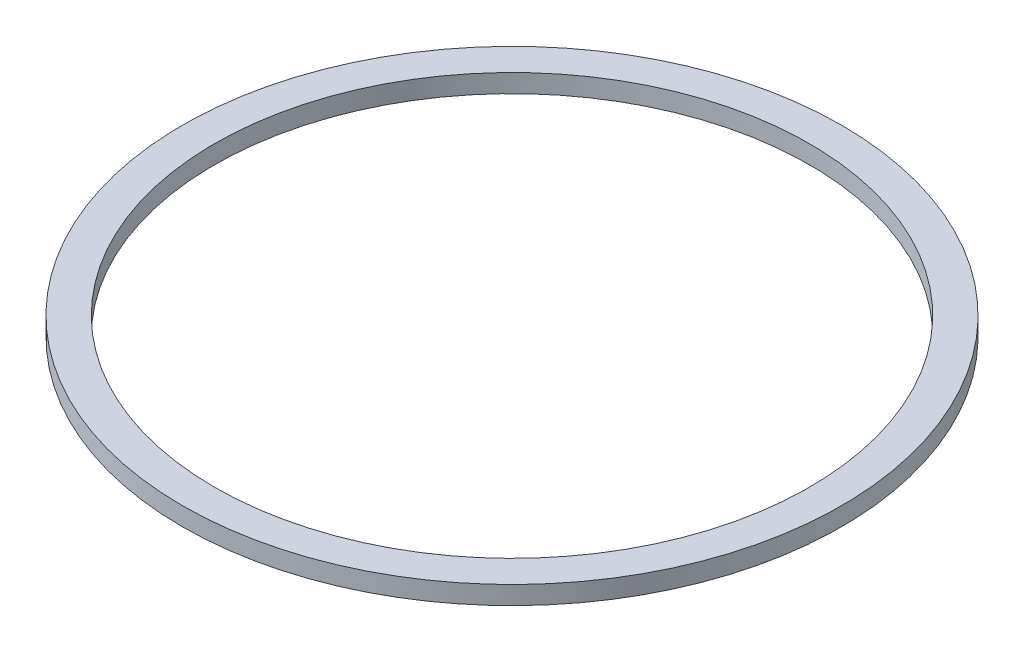
ISO-10303-21;
HEADER;
FILE_DESCRIPTION(('STEP AP214'),'2;1');
FILE_NAME('part.step','',(''),(''),'','','');
FILE_SCHEMA(('AUTOMOTIVE_DESIGN { 1 0 10303 214 1 1 1 1 }'));
ENDSEC;
DATA;
#1=APPLICATION_CONTEXT('core data for automotive mechanical design processes');
#2=APPLICATION_PROTOCOL_DEFINITION('international standard','automotive_design',2000,#1);
#3=PRODUCT_CONTEXT('',#1,'mechanical');
#4=PRODUCT('Part','Part','',(#3));
#5=PRODUCT_RELATED_PRODUCT_CATEGORY('part','',(#4));
#6=PRODUCT_DEFINITION_FORMATION('','',#4);
#7=PRODUCT_DEFINITION_CONTEXT('part definition',#1,'design');
#8=PRODUCT_DEFINITION('design','',#6,#7);
#9=PRODUCT_DEFINITION_SHAPE('','',#8);
#10=(LENGTH_UNIT() NAMED_UNIT(*) SI_UNIT(.MILLI.,.METRE.));
#11=(NAMED_UNIT(*) PLANE_ANGLE_UNIT() SI_UNIT($,.RADIAN.));
#12=(NAMED_UNIT(*) SI_UNIT($,.STERADIAN.) SOLID_ANGLE_UNIT());
#13=UNCERTAINTY_MEASURE_WITH_UNIT(LENGTH_MEASURE(1.E-05),#10,'distance_accuracy_value','');
#14=(GEOMETRIC_REPRESENTATION_CONTEXT(3) GLOBAL_UNCERTAINTY_ASSIGNED_CONTEXT((#13)) GLOBAL_UNIT_ASSIGNED_CONTEXT((#10,
#11,#12)) REPRESENTATION_CONTEXT('',''));
#15=CARTESIAN_POINT('',(0.,0.,0.));
#16=DIRECTION('',(0.,0.,1.));
#17=DIRECTION('',(1.,0.,0.));
#18=AXIS2_PLACEMENT_3D('',#15,#16,#17);
#19=CARTESIAN_POINT('',(0.,5.,0.));
#20=DIRECTION('',(0.,1.,0.));
#21=DIRECTION('',(0.,0.,1.));
#22=AXIS2_PLACEMENT_3D('',#19,#20,#21);
#23=PLANE('',#22);
#24=CARTESIAN_POINT('',(0.,5.,0.));
#25=DIRECTION('',(0.,1.,0.));
#26=DIRECTION('',(0.,0.,1.));
#27=AXIS2_PLACEMENT_3D('',#24,#25,#26);
#28=CIRCLE('',#27,180.);
#29=CARTESIAN_POINT('',(0.,5.,180.));
#30=VERTEX_POINT('',#29);
#31=EDGE_CURVE('E10',#30,#30,#28,.T.);
#32=ORIENTED_EDGE('',*,*,#31,.T.);
#33=EDGE_LOOP('',(#32));
#34=FACE_BOUND('',#33,.T.);
#35=CARTESIAN_POINT('',(0.,5.,0.));
#36=DIRECTION('',(0.,1.,0.));
#37=DIRECTION('',(0.,0.,1.));
#38=AXIS2_PLACEMENT_3D('',#35,#36,#37);
#39=CIRCLE('',#38,162.5);
#40=CARTESIAN_POINT('',(0.,5.,162.5));
#41=VERTEX_POINT('',#40);
#42=EDGE_CURVE('E50',#41,#41,#39,.T.);
#43=ORIENTED_EDGE('',*,*,#42,.F.);
#44=EDGE_LOOP('',(#43));
#45=FACE_BOUND('',#44,.T.);
#46=ADVANCED_FACE('F37',(#34,#45),#23,.T.);
#47=CARTESIAN_POINT('',(0.,-5.,0.));
#48=DIRECTION('',(0.,1.,0.));
#49=DIRECTION('',(0.,0.,1.));
#50=AXIS2_PLACEMENT_3D('',#47,#48,#49);
#51=PLANE('',#50);
#52=CARTESIAN_POINT('',(0.,-5.,0.));
#53=DIRECTION('',(0.,1.,0.));
#54=DIRECTION('',(0.,0.,1.));
#55=AXIS2_PLACEMENT_3D('',#52,#53,#54);
#56=CIRCLE('',#55,180.);
#57=CARTESIAN_POINT('',(0.,-5.,180.));
#58=VERTEX_POINT('',#57);
#59=EDGE_CURVE('E41',#58,#58,#56,.T.);
#60=ORIENTED_EDGE('',*,*,#59,.F.);
#61=EDGE_LOOP('',(#60));
#62=FACE_BOUND('',#61,.T.);
#63=CARTESIAN_POINT('',(0.,-5.,0.));
#64=DIRECTION('',(0.,1.,0.));
#65=DIRECTION('',(0.,0.,1.));
#66=AXIS2_PLACEMENT_3D('',#63,#64,#65);
#67=CIRCLE('',#66,162.5);
#68=CARTESIAN_POINT('',(0.,-5.,162.5));
#69=VERTEX_POINT('',#68);
#70=EDGE_CURVE('E52',#69,#69,#67,.T.);
#71=ORIENTED_EDGE('',*,*,#70,.T.);
#72=EDGE_LOOP('',(#71));
#73=FACE_BOUND('',#72,.T.);
#74=ADVANCED_FACE('F64',(#62,#73),#51,.F.);
#75=CARTESIAN_POINT('',(0.,5.,0.));
#76=DIRECTION('',(0.,-1.,0.));
#77=DIRECTION('',(0.,0.,-1.));
#78=AXIS2_PLACEMENT_3D('',#75,#76,#77);
#79=CYLINDRICAL_SURFACE('',#78,180.);
#80=ORIENTED_EDGE('',*,*,#31,.F.);
#81=EDGE_LOOP('',(#80));
#82=FACE_BOUND('',#81,.T.);
#83=ORIENTED_EDGE('',*,*,#59,.T.);
#84=EDGE_LOOP('',(#83));
#85=FACE_BOUND('',#84,.T.);
#86=ADVANCED_FACE('F39',(#82,#85),#79,.T.);
#87=CARTESIAN_POINT('',(0.,5.,0.));
#88=DIRECTION('',(0.,-1.,0.));
#89=DIRECTION('',(0.,0.,-1.));
#90=AXIS2_PLACEMENT_3D('',#87,#88,#89);
#91=CYLINDRICAL_SURFACE('',#90,162.5);
#92=ORIENTED_EDGE('',*,*,#42,.T.);
#93=EDGE_LOOP('',(#92));
#94=FACE_BOUND('',#93,.T.);
#95=ORIENTED_EDGE('',*,*,#70,.F.);
#96=EDGE_LOOP('',(#95));
#97=FACE_BOUND('',#96,.T.);
#98=ADVANCED_FACE('F60',(#94,#97),#91,.F.);
#99=CLOSED_SHELL('',(#46,#74,#86,#98));
#100=MANIFOLD_SOLID_BREP('B2',#99);
#101=ADVANCED_BREP_SHAPE_REPRESENTATION('',(#18,#100),#14);
#102=SHAPE_DEFINITION_REPRESENTATION(#9,#101);
ENDSEC;
END-ISO-10303-21;
